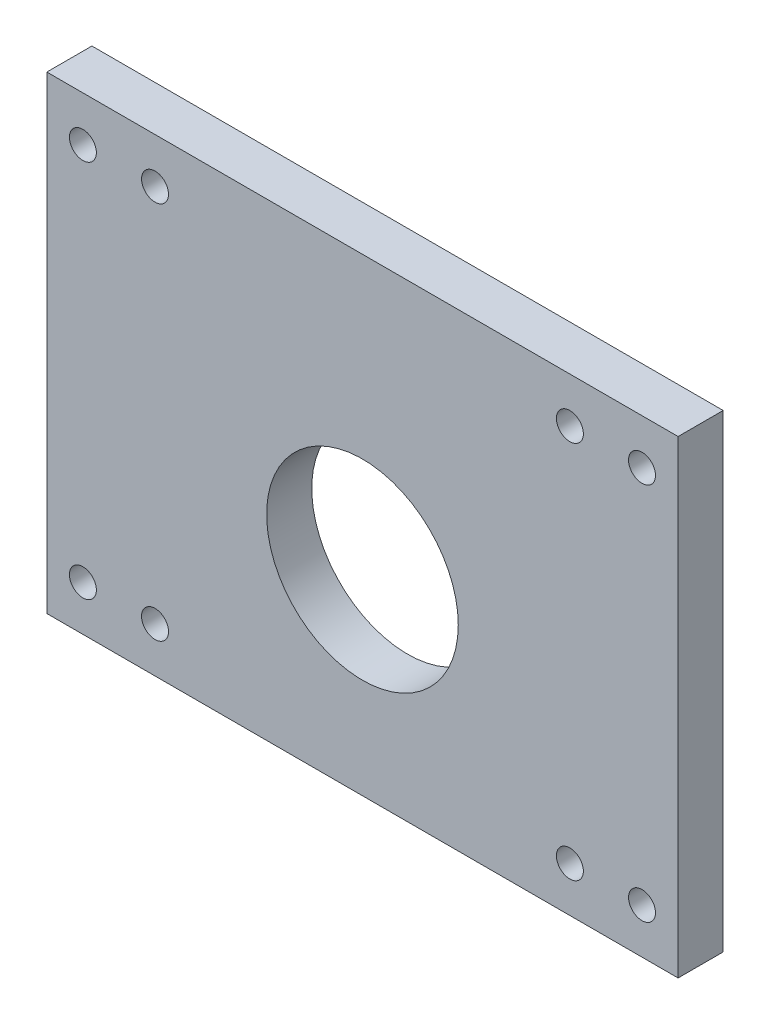
ISO-10303-21;
HEADER;
FILE_DESCRIPTION(('STEP AP214'),'2;1');
FILE_NAME('part.step','',(''),(''),'','','');
FILE_SCHEMA(('AUTOMOTIVE_DESIGN { 1 0 10303 214 1 1 1 1 }'));
ENDSEC;
DATA;
#1=APPLICATION_CONTEXT('core data for automotive mechanical design processes');
#2=APPLICATION_PROTOCOL_DEFINITION('international standard','automotive_design',2000,#1);
#3=PRODUCT_CONTEXT('',#1,'mechanical');
#4=PRODUCT('Part','Part','',(#3));
#5=PRODUCT_RELATED_PRODUCT_CATEGORY('part','',(#4));
#6=PRODUCT_DEFINITION_FORMATION('','',#4);
#7=PRODUCT_DEFINITION_CONTEXT('part definition',#1,'design');
#8=PRODUCT_DEFINITION('design','',#6,#7);
#9=PRODUCT_DEFINITION_SHAPE('','',#8);
#10=(LENGTH_UNIT() NAMED_UNIT(*) SI_UNIT(.MILLI.,.METRE.));
#11=(NAMED_UNIT(*) PLANE_ANGLE_UNIT() SI_UNIT($,.RADIAN.));
#12=(NAMED_UNIT(*) SI_UNIT($,.STERADIAN.) SOLID_ANGLE_UNIT());
#13=UNCERTAINTY_MEASURE_WITH_UNIT(LENGTH_MEASURE(1.E-05),#10,'distance_accuracy_value','');
#14=(GEOMETRIC_REPRESENTATION_CONTEXT(3) GLOBAL_UNCERTAINTY_ASSIGNED_CONTEXT((#13)) GLOBAL_UNIT_ASSIGNED_CONTEXT((#10,
#11,#12)) REPRESENTATION_CONTEXT('',''));
#15=CARTESIAN_POINT('',(0.,0.,0.));
#16=DIRECTION('',(0.,0.,1.));
#17=DIRECTION('',(1.,0.,0.));
#18=AXIS2_PLACEMENT_3D('',#15,#16,#17);
#19=CARTESIAN_POINT('',(0.,0.,6.35));
#20=DIRECTION('',(0.,0.,1.));
#21=DIRECTION('',(1.,0.,0.));
#22=AXIS2_PLACEMENT_3D('',#19,#20,#21);
#23=PLANE('',#22);
#24=CARTESIAN_POINT('',(-39.37,26.67,6.35));
#25=DIRECTION('',(0.,0.,1.));
#26=DIRECTION('',(1.,0.,0.));
#27=AXIS2_PLACEMENT_3D('',#24,#25,#26);
#28=CIRCLE('',#27,1.89864999999999);
#29=CARTESIAN_POINT('',(-37.47135,26.67,6.35));
#30=VERTEX_POINT('',#29);
#31=EDGE_CURVE('E162',#30,#30,#28,.T.);
#32=ORIENTED_EDGE('',*,*,#31,.F.);
#33=EDGE_LOOP('',(#32));
#34=FACE_BOUND('',#33,.T.);
#35=CARTESIAN_POINT('',(-29.21,26.67,6.35));
#36=DIRECTION('',(0.,0.,1.));
#37=DIRECTION('',(1.,0.,0.));
#38=AXIS2_PLACEMENT_3D('',#35,#36,#37);
#39=CIRCLE('',#38,1.89864999999999);
#40=CARTESIAN_POINT('',(-27.31135,26.67,6.35));
#41=VERTEX_POINT('',#40);
#42=EDGE_CURVE('E156',#41,#41,#39,.T.);
#43=ORIENTED_EDGE('',*,*,#42,.F.);
#44=EDGE_LOOP('',(#43));
#45=FACE_BOUND('',#44,.T.);
#46=CARTESIAN_POINT('',(29.21,26.67,6.35));
#47=DIRECTION('',(0.,0.,1.));
#48=DIRECTION('',(1.,0.,0.));
#49=AXIS2_PLACEMENT_3D('',#46,#47,#48);
#50=CIRCLE('',#49,1.89864999999999);
#51=CARTESIAN_POINT('',(31.10865,26.67,6.35));
#52=VERTEX_POINT('',#51);
#53=EDGE_CURVE('E150',#52,#52,#50,.T.);
#54=ORIENTED_EDGE('',*,*,#53,.F.);
#55=EDGE_LOOP('',(#54));
#56=FACE_BOUND('',#55,.T.);
#57=CARTESIAN_POINT('',(39.37,26.67,6.35));
#58=DIRECTION('',(0.,0.,1.));
#59=DIRECTION('',(1.,0.,0.));
#60=AXIS2_PLACEMENT_3D('',#57,#58,#59);
#61=CIRCLE('',#60,1.89864999999999);
#62=CARTESIAN_POINT('',(41.26865,26.67,6.35));
#63=VERTEX_POINT('',#62);
#64=EDGE_CURVE('E144',#63,#63,#61,.T.);
#65=ORIENTED_EDGE('',*,*,#64,.F.);
#66=EDGE_LOOP('',(#65));
#67=FACE_BOUND('',#66,.T.);
#68=CARTESIAN_POINT('',(-39.37,-26.67,6.35));
#69=DIRECTION('',(0.,0.,1.));
#70=DIRECTION('',(1.,0.,0.));
#71=AXIS2_PLACEMENT_3D('',#68,#69,#70);
#72=CIRCLE('',#71,1.89864999999999);
#73=CARTESIAN_POINT('',(-37.47135,-26.67,6.35));
#74=VERTEX_POINT('',#73);
#75=EDGE_CURVE('E138',#74,#74,#72,.T.);
#76=ORIENTED_EDGE('',*,*,#75,.F.);
#77=EDGE_LOOP('',(#76));
#78=FACE_BOUND('',#77,.T.);
#79=CARTESIAN_POINT('',(-29.21,-26.67,6.35));
#80=DIRECTION('',(0.,0.,1.));
#81=DIRECTION('',(1.,0.,0.));
#82=AXIS2_PLACEMENT_3D('',#79,#80,#81);
#83=CIRCLE('',#82,1.89864999999999);
#84=CARTESIAN_POINT('',(-27.31135,-26.67,6.35));
#85=VERTEX_POINT('',#84);
#86=EDGE_CURVE('E132',#85,#85,#83,.T.);
#87=ORIENTED_EDGE('',*,*,#86,.F.);
#88=EDGE_LOOP('',(#87));
#89=FACE_BOUND('',#88,.T.);
#90=CARTESIAN_POINT('',(29.21,-26.67,6.35));
#91=DIRECTION('',(0.,0.,1.));
#92=DIRECTION('',(1.,0.,0.));
#93=AXIS2_PLACEMENT_3D('',#90,#91,#92);
#94=CIRCLE('',#93,1.89864999999999);
#95=CARTESIAN_POINT('',(31.10865,-26.67,6.35));
#96=VERTEX_POINT('',#95);
#97=EDGE_CURVE('E126',#96,#96,#94,.T.);
#98=ORIENTED_EDGE('',*,*,#97,.F.);
#99=EDGE_LOOP('',(#98));
#100=FACE_BOUND('',#99,.T.);
#101=CARTESIAN_POINT('',(39.37,-26.67,6.35));
#102=DIRECTION('',(0.,0.,1.));
#103=DIRECTION('',(1.,0.,0.));
#104=AXIS2_PLACEMENT_3D('',#101,#102,#103);
#105=CIRCLE('',#104,1.89864999999999);
#106=CARTESIAN_POINT('',(41.26865,-26.67,6.35));
#107=VERTEX_POINT('',#106);
#108=EDGE_CURVE('E120',#107,#107,#105,.T.);
#109=ORIENTED_EDGE('',*,*,#108,.F.);
#110=EDGE_LOOP('',(#109));
#111=FACE_BOUND('',#110,.T.);
#112=DIRECTION('',(0.,-1.,0.));
#113=VECTOR('',#112,1.);
#114=CARTESIAN_POINT('',(-44.45,-33.02,6.35));
#115=LINE('',#114,#113);
#116=CARTESIAN_POINT('',(-44.45,33.02,6.35));
#117=VERTEX_POINT('',#116);
#118=CARTESIAN_POINT('',(-44.45,-33.02,6.35));
#119=VERTEX_POINT('',#118);
#120=EDGE_CURVE('E85',#117,#119,#115,.T.);
#121=ORIENTED_EDGE('',*,*,#120,.T.);
#122=DIRECTION('',(1.,0.,0.));
#123=VECTOR('',#122,1.);
#124=CARTESIAN_POINT('',(44.45,-33.02,6.35));
#125=LINE('',#124,#123);
#126=CARTESIAN_POINT('',(44.45,-33.02,6.35));
#127=VERTEX_POINT('',#126);
#128=EDGE_CURVE('E80',#119,#127,#125,.T.);
#129=ORIENTED_EDGE('',*,*,#128,.T.);
#130=DIRECTION('',(0.,1.,0.));
#131=VECTOR('',#130,1.);
#132=CARTESIAN_POINT('',(44.45,-33.02,6.35));
#133=LINE('',#132,#131);
#134=CARTESIAN_POINT('',(44.45,33.02,6.35));
#135=VERTEX_POINT('',#134);
#136=EDGE_CURVE('E83',#127,#135,#133,.T.);
#137=ORIENTED_EDGE('',*,*,#136,.T.);
#138=DIRECTION('',(-1.,0.,0.));
#139=VECTOR('',#138,1.);
#140=CARTESIAN_POINT('',(44.45,33.02,6.35));
#141=LINE('',#140,#139);
#142=EDGE_CURVE('E50',#135,#117,#141,.T.);
#143=ORIENTED_EDGE('',*,*,#142,.T.);
#144=EDGE_LOOP('',(#121,#129,#137,#143));
#145=FACE_BOUND('',#144,.T.);
#146=CARTESIAN_POINT('',(0.,-5.43814,6.35));
#147=DIRECTION('',(0.,0.,1.));
#148=DIRECTION('',(1.,0.,0.));
#149=AXIS2_PLACEMENT_3D('',#146,#147,#148);
#150=CIRCLE('',#149,13.49375);
#151=CARTESIAN_POINT('',(13.49375,-5.43814,6.35));
#152=VERTEX_POINT('',#151);
#153=EDGE_CURVE('E100',#152,#152,#150,.T.);
#154=ORIENTED_EDGE('',*,*,#153,.F.);
#155=EDGE_LOOP('',(#154));
#156=FACE_BOUND('',#155,.T.);
#157=ADVANCED_FACE('F33',(#34,#45,#56,#67,#78,#89,#100,#111,#145,#156),#23,.T.);
#158=CARTESIAN_POINT('',(0.,0.,0.));
#159=DIRECTION('',(0.,0.,1.));
#160=DIRECTION('',(1.,0.,0.));
#161=AXIS2_PLACEMENT_3D('',#158,#159,#160);
#162=PLANE('',#161);
#163=CARTESIAN_POINT('',(-39.37,26.67,0.));
#164=DIRECTION('',(0.,0.,1.));
#165=DIRECTION('',(1.,0.,0.));
#166=AXIS2_PLACEMENT_3D('',#163,#164,#165);
#167=CIRCLE('',#166,1.89864999999999);
#168=CARTESIAN_POINT('',(-37.47135,26.67,0.));
#169=VERTEX_POINT('',#168);
#170=EDGE_CURVE('E159',#169,#169,#167,.T.);
#171=ORIENTED_EDGE('',*,*,#170,.T.);
#172=EDGE_LOOP('',(#171));
#173=FACE_BOUND('',#172,.T.);
#174=CARTESIAN_POINT('',(-29.21,26.67,0.));
#175=DIRECTION('',(0.,0.,1.));
#176=DIRECTION('',(1.,0.,0.));
#177=AXIS2_PLACEMENT_3D('',#174,#175,#176);
#178=CIRCLE('',#177,1.89864999999999);
#179=CARTESIAN_POINT('',(-27.31135,26.67,0.));
#180=VERTEX_POINT('',#179);
#181=EDGE_CURVE('E153',#180,#180,#178,.T.);
#182=ORIENTED_EDGE('',*,*,#181,.T.);
#183=EDGE_LOOP('',(#182));
#184=FACE_BOUND('',#183,.T.);
#185=CARTESIAN_POINT('',(29.21,26.67,0.));
#186=DIRECTION('',(0.,0.,1.));
#187=DIRECTION('',(1.,0.,0.));
#188=AXIS2_PLACEMENT_3D('',#185,#186,#187);
#189=CIRCLE('',#188,1.89864999999999);
#190=CARTESIAN_POINT('',(31.10865,26.67,0.));
#191=VERTEX_POINT('',#190);
#192=EDGE_CURVE('E147',#191,#191,#189,.T.);
#193=ORIENTED_EDGE('',*,*,#192,.T.);
#194=EDGE_LOOP('',(#193));
#195=FACE_BOUND('',#194,.T.);
#196=CARTESIAN_POINT('',(39.37,26.67,0.));
#197=DIRECTION('',(0.,0.,1.));
#198=DIRECTION('',(1.,0.,0.));
#199=AXIS2_PLACEMENT_3D('',#196,#197,#198);
#200=CIRCLE('',#199,1.89864999999999);
#201=CARTESIAN_POINT('',(41.26865,26.67,0.));
#202=VERTEX_POINT('',#201);
#203=EDGE_CURVE('E141',#202,#202,#200,.T.);
#204=ORIENTED_EDGE('',*,*,#203,.T.);
#205=EDGE_LOOP('',(#204));
#206=FACE_BOUND('',#205,.T.);
#207=CARTESIAN_POINT('',(-39.37,-26.67,0.));
#208=DIRECTION('',(0.,0.,1.));
#209=DIRECTION('',(1.,0.,0.));
#210=AXIS2_PLACEMENT_3D('',#207,#208,#209);
#211=CIRCLE('',#210,1.89864999999999);
#212=CARTESIAN_POINT('',(-37.47135,-26.67,0.));
#213=VERTEX_POINT('',#212);
#214=EDGE_CURVE('E135',#213,#213,#211,.T.);
#215=ORIENTED_EDGE('',*,*,#214,.T.);
#216=EDGE_LOOP('',(#215));
#217=FACE_BOUND('',#216,.T.);
#218=CARTESIAN_POINT('',(-29.21,-26.67,0.));
#219=DIRECTION('',(0.,0.,1.));
#220=DIRECTION('',(1.,0.,0.));
#221=AXIS2_PLACEMENT_3D('',#218,#219,#220);
#222=CIRCLE('',#221,1.89864999999999);
#223=CARTESIAN_POINT('',(-27.31135,-26.67,0.));
#224=VERTEX_POINT('',#223);
#225=EDGE_CURVE('E129',#224,#224,#222,.T.);
#226=ORIENTED_EDGE('',*,*,#225,.T.);
#227=EDGE_LOOP('',(#226));
#228=FACE_BOUND('',#227,.T.);
#229=CARTESIAN_POINT('',(29.21,-26.67,0.));
#230=DIRECTION('',(0.,0.,1.));
#231=DIRECTION('',(1.,0.,0.));
#232=AXIS2_PLACEMENT_3D('',#229,#230,#231);
#233=CIRCLE('',#232,1.89864999999999);
#234=CARTESIAN_POINT('',(31.10865,-26.67,0.));
#235=VERTEX_POINT('',#234);
#236=EDGE_CURVE('E123',#235,#235,#233,.T.);
#237=ORIENTED_EDGE('',*,*,#236,.T.);
#238=EDGE_LOOP('',(#237));
#239=FACE_BOUND('',#238,.T.);
#240=CARTESIAN_POINT('',(39.37,-26.67,0.));
#241=DIRECTION('',(0.,0.,1.));
#242=DIRECTION('',(1.,0.,0.));
#243=AXIS2_PLACEMENT_3D('',#240,#241,#242);
#244=CIRCLE('',#243,1.89864999999999);
#245=CARTESIAN_POINT('',(41.26865,-26.67,0.));
#246=VERTEX_POINT('',#245);
#247=EDGE_CURVE('E115',#246,#246,#244,.T.);
#248=ORIENTED_EDGE('',*,*,#247,.T.);
#249=EDGE_LOOP('',(#248));
#250=FACE_BOUND('',#249,.T.);
#251=DIRECTION('',(0.,-1.,0.));
#252=VECTOR('',#251,1.);
#253=CARTESIAN_POINT('',(-44.45,-33.02,0.));
#254=LINE('',#253,#252);
#255=CARTESIAN_POINT('',(-44.45,33.02,0.));
#256=VERTEX_POINT('',#255);
#257=CARTESIAN_POINT('',(-44.45,-33.02,0.));
#258=VERTEX_POINT('',#257);
#259=EDGE_CURVE('E97',#256,#258,#254,.T.);
#260=ORIENTED_EDGE('',*,*,#259,.F.);
#261=DIRECTION('',(-1.,0.,0.));
#262=VECTOR('',#261,1.);
#263=CARTESIAN_POINT('',(44.45,33.02,0.));
#264=LINE('',#263,#262);
#265=CARTESIAN_POINT('',(44.45,33.02,0.));
#266=VERTEX_POINT('',#265);
#267=EDGE_CURVE('E73',#266,#256,#264,.T.);
#268=ORIENTED_EDGE('',*,*,#267,.F.);
#269=DIRECTION('',(0.,1.,0.));
#270=VECTOR('',#269,1.);
#271=CARTESIAN_POINT('',(44.45,-33.02,0.));
#272=LINE('',#271,#270);
#273=CARTESIAN_POINT('',(44.45,-33.02,0.));
#274=VERTEX_POINT('',#273);
#275=EDGE_CURVE('E67',#274,#266,#272,.T.);
#276=ORIENTED_EDGE('',*,*,#275,.F.);
#277=DIRECTION('',(1.,0.,0.));
#278=VECTOR('',#277,1.);
#279=CARTESIAN_POINT('',(44.45,-33.02,0.));
#280=LINE('',#279,#278);
#281=EDGE_CURVE('E89',#258,#274,#280,.T.);
#282=ORIENTED_EDGE('',*,*,#281,.F.);
#283=EDGE_LOOP('',(#260,#268,#276,#282));
#284=FACE_BOUND('',#283,.T.);
#285=CARTESIAN_POINT('',(0.,-5.43814,0.));
#286=DIRECTION('',(0.,0.,1.));
#287=DIRECTION('',(1.,0.,0.));
#288=AXIS2_PLACEMENT_3D('',#285,#286,#287);
#289=CIRCLE('',#288,13.49375);
#290=CARTESIAN_POINT('',(13.49375,-5.43814,0.));
#291=VERTEX_POINT('',#290);
#292=EDGE_CURVE('E112',#291,#291,#289,.T.);
#293=ORIENTED_EDGE('',*,*,#292,.T.);
#294=EDGE_LOOP('',(#293));
#295=FACE_BOUND('',#294,.T.);
#296=ADVANCED_FACE('F108',(#173,#184,#195,#206,#217,#228,#239,#250,#284,#295),#162,.F.);
#297=CARTESIAN_POINT('',(-44.45,-33.02,6.35));
#298=DIRECTION('',(1.,0.,0.));
#299=DIRECTION('',(0.,0.,-1.));
#300=AXIS2_PLACEMENT_3D('',#297,#298,#299);
#301=PLANE('',#300);
#302=ORIENTED_EDGE('',*,*,#259,.T.);
#303=DIRECTION('',(0.,0.,-1.));
#304=VECTOR('',#303,1.);
#305=CARTESIAN_POINT('',(-44.45,-33.02,6.35));
#306=LINE('',#305,#304);
#307=EDGE_CURVE('E11',#119,#258,#306,.T.);
#308=ORIENTED_EDGE('',*,*,#307,.F.);
#309=ORIENTED_EDGE('',*,*,#120,.F.);
#310=DIRECTION('',(0.,0.,-1.));
#311=VECTOR('',#310,1.);
#312=CARTESIAN_POINT('',(-44.45,33.02,6.35));
#313=LINE('',#312,#311);
#314=EDGE_CURVE('E93',#117,#256,#313,.T.);
#315=ORIENTED_EDGE('',*,*,#314,.T.);
#316=EDGE_LOOP('',(#302,#308,#309,#315));
#317=FACE_BOUND('',#316,.T.);
#318=ADVANCED_FACE('F35',(#317),#301,.F.);
#319=CARTESIAN_POINT('',(44.45,-33.02,6.35));
#320=DIRECTION('',(0.,1.,0.));
#321=DIRECTION('',(-1.,0.,0.));
#322=AXIS2_PLACEMENT_3D('',#319,#320,#321);
#323=PLANE('',#322);
#324=ORIENTED_EDGE('',*,*,#281,.T.);
#325=DIRECTION('',(0.,0.,-1.));
#326=VECTOR('',#325,1.);
#327=CARTESIAN_POINT('',(44.45,-33.02,6.35));
#328=LINE('',#327,#326);
#329=EDGE_CURVE('E42',#127,#274,#328,.T.);
#330=ORIENTED_EDGE('',*,*,#329,.F.);
#331=ORIENTED_EDGE('',*,*,#128,.F.);
#332=ORIENTED_EDGE('',*,*,#307,.T.);
#333=EDGE_LOOP('',(#324,#330,#331,#332));
#334=FACE_BOUND('',#333,.T.);
#335=ADVANCED_FACE('F88',(#334),#323,.F.);
#336=CARTESIAN_POINT('',(44.45,-33.02,6.35));
#337=DIRECTION('',(-1.,0.,0.));
#338=DIRECTION('',(0.,0.,1.));
#339=AXIS2_PLACEMENT_3D('',#336,#337,#338);
#340=PLANE('',#339);
#341=ORIENTED_EDGE('',*,*,#275,.T.);
#342=DIRECTION('',(0.,0.,-1.));
#343=VECTOR('',#342,1.);
#344=CARTESIAN_POINT('',(44.45,33.02,6.35));
#345=LINE('',#344,#343);
#346=EDGE_CURVE('E90',#135,#266,#345,.T.);
#347=ORIENTED_EDGE('',*,*,#346,.F.);
#348=ORIENTED_EDGE('',*,*,#136,.F.);
#349=ORIENTED_EDGE('',*,*,#329,.T.);
#350=EDGE_LOOP('',(#341,#347,#348,#349));
#351=FACE_BOUND('',#350,.T.);
#352=ADVANCED_FACE('F91',(#351),#340,.F.);
#353=CARTESIAN_POINT('',(44.45,33.02,6.35));
#354=DIRECTION('',(0.,-1.,0.));
#355=DIRECTION('',(1.,0.,0.));
#356=AXIS2_PLACEMENT_3D('',#353,#354,#355);
#357=PLANE('',#356);
#358=ORIENTED_EDGE('',*,*,#267,.T.);
#359=ORIENTED_EDGE('',*,*,#314,.F.);
#360=ORIENTED_EDGE('',*,*,#142,.F.);
#361=ORIENTED_EDGE('',*,*,#346,.T.);
#362=EDGE_LOOP('',(#358,#359,#360,#361));
#363=FACE_BOUND('',#362,.T.);
#364=ADVANCED_FACE('F105',(#363),#357,.F.);
#365=CARTESIAN_POINT('',(0.,-5.43814,6.35));
#366=DIRECTION('',(0.,0.,-1.));
#367=DIRECTION('',(-1.,0.,0.));
#368=AXIS2_PLACEMENT_3D('',#365,#366,#367);
#369=CYLINDRICAL_SURFACE('',#368,13.49375);
#370=ORIENTED_EDGE('',*,*,#153,.T.);
#371=EDGE_LOOP('',(#370));
#372=FACE_BOUND('',#371,.T.);
#373=ORIENTED_EDGE('',*,*,#292,.F.);
#374=EDGE_LOOP('',(#373));
#375=FACE_BOUND('',#374,.T.);
#376=ADVANCED_FACE('F188',(#372,#375),#369,.F.);
#377=CARTESIAN_POINT('',(39.37,-26.67,6.35));
#378=DIRECTION('',(0.,0.,1.));
#379=DIRECTION('',(1.,0.,0.));
#380=AXIS2_PLACEMENT_3D('',#377,#378,#379);
#381=CYLINDRICAL_SURFACE('',#380,1.89864999999999);
#382=ORIENTED_EDGE('',*,*,#247,.F.);
#383=EDGE_LOOP('',(#382));
#384=FACE_BOUND('',#383,.T.);
#385=ORIENTED_EDGE('',*,*,#108,.T.);
#386=EDGE_LOOP('',(#385));
#387=FACE_BOUND('',#386,.T.);
#388=ADVANCED_FACE('F185',(#384,#387),#381,.F.);
#389=CARTESIAN_POINT('',(29.21,-26.67,6.35));
#390=DIRECTION('',(0.,0.,1.));
#391=DIRECTION('',(1.,0.,0.));
#392=AXIS2_PLACEMENT_3D('',#389,#390,#391);
#393=CYLINDRICAL_SURFACE('',#392,1.89864999999999);
#394=ORIENTED_EDGE('',*,*,#236,.F.);
#395=EDGE_LOOP('',(#394));
#396=FACE_BOUND('',#395,.T.);
#397=ORIENTED_EDGE('',*,*,#97,.T.);
#398=EDGE_LOOP('',(#397));
#399=FACE_BOUND('',#398,.T.);
#400=ADVANCED_FACE('F187',(#396,#399),#393,.F.);
#401=CARTESIAN_POINT('',(-29.21,-26.67,6.35));
#402=DIRECTION('',(0.,0.,1.));
#403=DIRECTION('',(1.,0.,0.));
#404=AXIS2_PLACEMENT_3D('',#401,#402,#403);
#405=CYLINDRICAL_SURFACE('',#404,1.89864999999999);
#406=ORIENTED_EDGE('',*,*,#225,.F.);
#407=EDGE_LOOP('',(#406));
#408=FACE_BOUND('',#407,.T.);
#409=ORIENTED_EDGE('',*,*,#86,.T.);
#410=EDGE_LOOP('',(#409));
#411=FACE_BOUND('',#410,.T.);
#412=ADVANCED_FACE('F195',(#408,#411),#405,.F.);
#413=CARTESIAN_POINT('',(-39.37,-26.67,6.35));
#414=DIRECTION('',(0.,0.,1.));
#415=DIRECTION('',(1.,0.,0.));
#416=AXIS2_PLACEMENT_3D('',#413,#414,#415);
#417=CYLINDRICAL_SURFACE('',#416,1.89864999999999);
#418=ORIENTED_EDGE('',*,*,#214,.F.);
#419=EDGE_LOOP('',(#418));
#420=FACE_BOUND('',#419,.T.);
#421=ORIENTED_EDGE('',*,*,#75,.T.);
#422=EDGE_LOOP('',(#421));
#423=FACE_BOUND('',#422,.T.);
#424=ADVANCED_FACE('F229',(#420,#423),#417,.F.);
#425=CARTESIAN_POINT('',(39.37,26.67,6.35));
#426=DIRECTION('',(0.,0.,1.));
#427=DIRECTION('',(1.,0.,0.));
#428=AXIS2_PLACEMENT_3D('',#425,#426,#427);
#429=CYLINDRICAL_SURFACE('',#428,1.89864999999999);
#430=ORIENTED_EDGE('',*,*,#203,.F.);
#431=EDGE_LOOP('',(#430));
#432=FACE_BOUND('',#431,.T.);
#433=ORIENTED_EDGE('',*,*,#64,.T.);
#434=EDGE_LOOP('',(#433));
#435=FACE_BOUND('',#434,.T.);
#436=ADVANCED_FACE('F234',(#432,#435),#429,.F.);
#437=CARTESIAN_POINT('',(29.21,26.67,6.35));
#438=DIRECTION('',(0.,0.,1.));
#439=DIRECTION('',(1.,0.,0.));
#440=AXIS2_PLACEMENT_3D('',#437,#438,#439);
#441=CYLINDRICAL_SURFACE('',#440,1.89864999999999);
#442=ORIENTED_EDGE('',*,*,#192,.F.);
#443=EDGE_LOOP('',(#442));
#444=FACE_BOUND('',#443,.T.);
#445=ORIENTED_EDGE('',*,*,#53,.T.);
#446=EDGE_LOOP('',(#445));
#447=FACE_BOUND('',#446,.T.);
#448=ADVANCED_FACE('F289',(#444,#447),#441,.F.);
#449=CARTESIAN_POINT('',(-29.21,26.67,6.35));
#450=DIRECTION('',(0.,0.,1.));
#451=DIRECTION('',(1.,0.,0.));
#452=AXIS2_PLACEMENT_3D('',#449,#450,#451);
#453=CYLINDRICAL_SURFACE('',#452,1.89864999999999);
#454=ORIENTED_EDGE('',*,*,#181,.F.);
#455=EDGE_LOOP('',(#454));
#456=FACE_BOUND('',#455,.T.);
#457=ORIENTED_EDGE('',*,*,#42,.T.);
#458=EDGE_LOOP('',(#457));
#459=FACE_BOUND('',#458,.T.);
#460=ADVANCED_FACE('F293',(#456,#459),#453,.F.);
#461=CARTESIAN_POINT('',(-39.37,26.67,6.35));
#462=DIRECTION('',(0.,0.,1.));
#463=DIRECTION('',(1.,0.,0.));
#464=AXIS2_PLACEMENT_3D('',#461,#462,#463);
#465=CYLINDRICAL_SURFACE('',#464,1.89864999999999);
#466=ORIENTED_EDGE('',*,*,#170,.F.);
#467=EDGE_LOOP('',(#466));
#468=FACE_BOUND('',#467,.T.);
#469=ORIENTED_EDGE('',*,*,#31,.T.);
#470=EDGE_LOOP('',(#469));
#471=FACE_BOUND('',#470,.T.);
#472=ADVANCED_FACE('F166',(#468,#471),#465,.F.);
#473=CLOSED_SHELL('',(#157,#296,#318,#335,#352,#364,#376,#388,#400,#412,#424,#436,#448,#460,#472));
#474=MANIFOLD_SOLID_BREP('B2',#473);
#475=ADVANCED_BREP_SHAPE_REPRESENTATION('',(#18,#474),#14);
#476=SHAPE_DEFINITION_REPRESENTATION(#9,#475);
ENDSEC;
END-ISO-10303-21;
